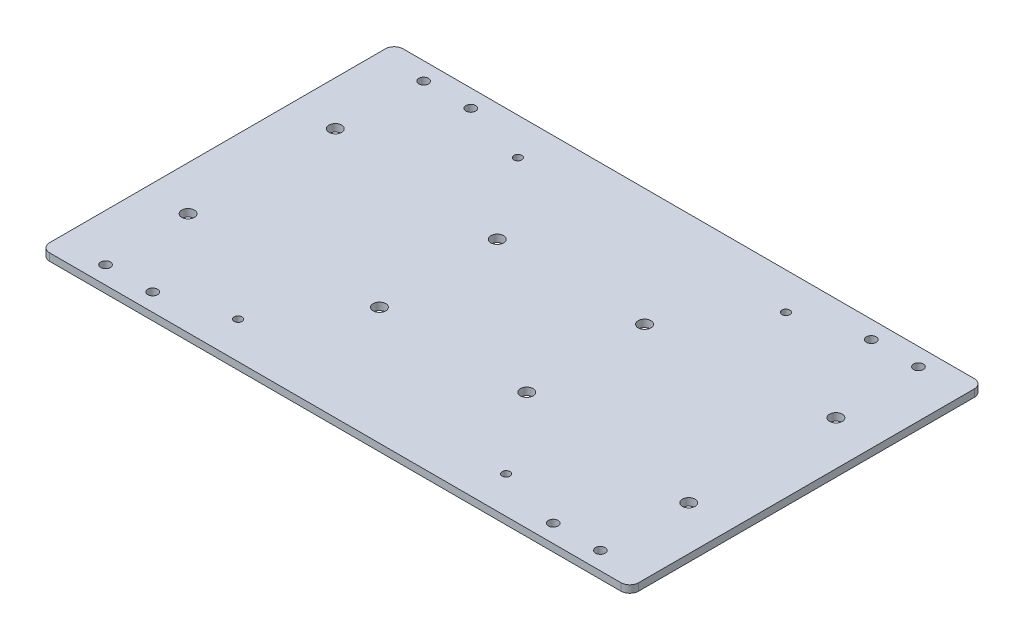
ISO-10303-21;
HEADER;
FILE_DESCRIPTION(('STEP AP214'),'2;1');
FILE_NAME('part.step','',(''),(''),'','','');
FILE_SCHEMA(('AUTOMOTIVE_DESIGN { 1 0 10303 214 1 1 1 1 }'));
ENDSEC;
DATA;
#1=APPLICATION_CONTEXT('core data for automotive mechanical design processes');
#2=APPLICATION_PROTOCOL_DEFINITION('international standard','automotive_design',2000,#1);
#3=PRODUCT_CONTEXT('',#1,'mechanical');
#4=PRODUCT('Part','Part','',(#3));
#5=PRODUCT_RELATED_PRODUCT_CATEGORY('part','',(#4));
#6=PRODUCT_DEFINITION_FORMATION('','',#4);
#7=PRODUCT_DEFINITION_CONTEXT('part definition',#1,'design');
#8=PRODUCT_DEFINITION('design','',#6,#7);
#9=PRODUCT_DEFINITION_SHAPE('','',#8);
#10=(LENGTH_UNIT() NAMED_UNIT(*) SI_UNIT(.MILLI.,.METRE.));
#11=(NAMED_UNIT(*) PLANE_ANGLE_UNIT() SI_UNIT($,.RADIAN.));
#12=(NAMED_UNIT(*) SI_UNIT($,.STERADIAN.) SOLID_ANGLE_UNIT());
#13=UNCERTAINTY_MEASURE_WITH_UNIT(LENGTH_MEASURE(1.E-05),#10,'distance_accuracy_value','');
#14=(GEOMETRIC_REPRESENTATION_CONTEXT(3) GLOBAL_UNCERTAINTY_ASSIGNED_CONTEXT((#13)) GLOBAL_UNIT_ASSIGNED_CONTEXT((#10,
#11,#12)) REPRESENTATION_CONTEXT('',''));
#15=CARTESIAN_POINT('',(0.,0.,0.));
#16=DIRECTION('',(0.,0.,1.));
#17=DIRECTION('',(1.,0.,0.));
#18=AXIS2_PLACEMENT_3D('',#15,#16,#17);
#19=CARTESIAN_POINT('',(0.,2.5,0.));
#20=DIRECTION('',(0.,1.,0.));
#21=DIRECTION('',(0.,0.,1.));
#22=AXIS2_PLACEMENT_3D('',#19,#20,#21);
#23=PLANE('',#22);
#24=CARTESIAN_POINT('',(45.5,2.5,-47.5));
#25=DIRECTION('',(0.,1.,0.));
#26=DIRECTION('',(0.,0.,1.));
#27=AXIS2_PLACEMENT_3D('',#24,#25,#26);
#28=CIRCLE('',#27,1.35000000000001);
#29=CARTESIAN_POINT('',(45.5,2.5,-46.15));
#30=VERTEX_POINT('',#29);
#31=EDGE_CURVE('E334',#30,#30,#28,.T.);
#32=ORIENTED_EDGE('',*,*,#31,.F.);
#33=EDGE_LOOP('',(#32));
#34=FACE_BOUND('',#33,.T.);
#35=CARTESIAN_POINT('',(-45.5,2.5,47.5));
#36=DIRECTION('',(0.,1.,0.));
#37=DIRECTION('',(0.,0.,1.));
#38=AXIS2_PLACEMENT_3D('',#35,#36,#37);
#39=CIRCLE('',#38,1.35000000000001);
#40=CARTESIAN_POINT('',(-45.5,2.5,48.85));
#41=VERTEX_POINT('',#40);
#42=EDGE_CURVE('E335',#41,#41,#39,.T.);
#43=ORIENTED_EDGE('',*,*,#42,.F.);
#44=EDGE_LOOP('',(#43));
#45=FACE_BOUND('',#44,.T.);
#46=CARTESIAN_POINT('',(45.5,2.5,47.5));
#47=DIRECTION('',(0.,1.,0.));
#48=DIRECTION('',(0.,0.,1.));
#49=AXIS2_PLACEMENT_3D('',#46,#47,#48);
#50=CIRCLE('',#49,1.35000000000001);
#51=CARTESIAN_POINT('',(45.5,2.5,48.85));
#52=VERTEX_POINT('',#51);
#53=EDGE_CURVE('E349',#52,#52,#50,.T.);
#54=ORIENTED_EDGE('',*,*,#53,.F.);
#55=EDGE_LOOP('',(#54));
#56=FACE_BOUND('',#55,.T.);
#57=CARTESIAN_POINT('',(-45.5,2.5,-47.5));
#58=DIRECTION('',(0.,1.,0.));
#59=DIRECTION('',(0.,0.,1.));
#60=AXIS2_PLACEMENT_3D('',#57,#58,#59);
#61=CIRCLE('',#60,1.35000000000001);
#62=CARTESIAN_POINT('',(-45.5,2.5,-46.15));
#63=VERTEX_POINT('',#62);
#64=EDGE_CURVE('E325',#63,#63,#61,.T.);
#65=ORIENTED_EDGE('',*,*,#64,.F.);
#66=EDGE_LOOP('',(#65));
#67=FACE_BOUND('',#66,.T.);
#68=CARTESIAN_POINT('',(-85.,2.5,25.));
#69=DIRECTION('',(0.,1.,0.));
#70=DIRECTION('',(0.,0.,-1.));
#71=AXIS2_PLACEMENT_3D('',#68,#69,#70);
#72=CIRCLE('',#71,2.15);
#73=CARTESIAN_POINT('',(-85.,2.5,22.85));
#74=VERTEX_POINT('',#73);
#75=EDGE_CURVE('E302',#74,#74,#72,.T.);
#76=ORIENTED_EDGE('',*,*,#75,.F.);
#77=EDGE_LOOP('',(#76));
#78=FACE_BOUND('',#77,.T.);
#79=CARTESIAN_POINT('',(85.,2.5,-25.));
#80=DIRECTION('',(0.,1.,0.));
#81=DIRECTION('',(0.,0.,1.));
#82=AXIS2_PLACEMENT_3D('',#79,#80,#81);
#83=CIRCLE('',#82,2.15);
#84=CARTESIAN_POINT('',(85.,2.5,-22.85));
#85=VERTEX_POINT('',#84);
#86=EDGE_CURVE('E286',#85,#85,#83,.T.);
#87=ORIENTED_EDGE('',*,*,#86,.F.);
#88=EDGE_LOOP('',(#87));
#89=FACE_BOUND('',#88,.T.);
#90=CARTESIAN_POINT('',(25.,2.5,20.));
#91=DIRECTION('',(0.,1.,0.));
#92=DIRECTION('',(0.,0.,1.));
#93=AXIS2_PLACEMENT_3D('',#90,#91,#92);
#94=CIRCLE('',#93,2.15);
#95=CARTESIAN_POINT('',(25.,2.5,22.15));
#96=VERTEX_POINT('',#95);
#97=EDGE_CURVE('E270',#96,#96,#94,.T.);
#98=ORIENTED_EDGE('',*,*,#97,.F.);
#99=EDGE_LOOP('',(#98));
#100=FACE_BOUND('',#99,.T.);
#101=CARTESIAN_POINT('',(25.,2.5,-20.));
#102=DIRECTION('',(0.,1.,0.));
#103=DIRECTION('',(0.,0.,1.));
#104=AXIS2_PLACEMENT_3D('',#101,#102,#103);
#105=CIRCLE('',#104,2.15);
#106=CARTESIAN_POINT('',(25.,2.5,-17.85));
#107=VERTEX_POINT('',#106);
#108=EDGE_CURVE('E254',#107,#107,#105,.T.);
#109=ORIENTED_EDGE('',*,*,#108,.F.);
#110=EDGE_LOOP('',(#109));
#111=FACE_BOUND('',#110,.T.);
#112=CARTESIAN_POINT('',(-68.,2.5,54.));
#113=DIRECTION('',(0.,1.,0.));
#114=DIRECTION('',(0.,0.,-1.));
#115=AXIS2_PLACEMENT_3D('',#112,#113,#114);
#116=CIRCLE('',#115,1.65);
#117=CARTESIAN_POINT('',(-68.,2.5,52.35));
#118=VERTEX_POINT('',#117);
#119=EDGE_CURVE('E238',#118,#118,#116,.T.);
#120=ORIENTED_EDGE('',*,*,#119,.F.);
#121=EDGE_LOOP('',(#120));
#122=FACE_BOUND('',#121,.T.);
#123=CARTESIAN_POINT('',(84.,2.5,54.));
#124=DIRECTION('',(0.,1.,0.));
#125=DIRECTION('',(0.,0.,-1.));
#126=AXIS2_PLACEMENT_3D('',#123,#124,#125);
#127=CIRCLE('',#126,1.65);
#128=CARTESIAN_POINT('',(84.,2.5,52.35));
#129=VERTEX_POINT('',#128);
#130=EDGE_CURVE('E222',#129,#129,#127,.T.);
#131=ORIENTED_EDGE('',*,*,#130,.F.);
#132=EDGE_LOOP('',(#131));
#133=FACE_BOUND('',#132,.T.);
#134=CARTESIAN_POINT('',(68.,2.5,-54.));
#135=DIRECTION('',(0.,1.,0.));
#136=DIRECTION('',(0.,0.,1.));
#137=AXIS2_PLACEMENT_3D('',#134,#135,#136);
#138=CIRCLE('',#137,1.65);
#139=CARTESIAN_POINT('',(68.,2.5,-52.35));
#140=VERTEX_POINT('',#139);
#141=EDGE_CURVE('E206',#140,#140,#138,.T.);
#142=ORIENTED_EDGE('',*,*,#141,.F.);
#143=EDGE_LOOP('',(#142));
#144=FACE_BOUND('',#143,.T.);
#145=CARTESIAN_POINT('',(-84.,2.5,-54.));
#146=DIRECTION('',(0.,1.,0.));
#147=DIRECTION('',(0.,0.,1.));
#148=AXIS2_PLACEMENT_3D('',#145,#146,#147);
#149=CIRCLE('',#148,1.65);
#150=CARTESIAN_POINT('',(-84.,2.5,-52.35));
#151=VERTEX_POINT('',#150);
#152=EDGE_CURVE('E143',#151,#151,#149,.T.);
#153=ORIENTED_EDGE('',*,*,#152,.F.);
#154=EDGE_LOOP('',(#153));
#155=FACE_BOUND('',#154,.T.);
#156=DIRECTION('',(0.,0.,1.));
#157=VECTOR('',#156,1.);
#158=CARTESIAN_POINT('',(-100.,2.5,-60.));
#159=LINE('',#158,#157);
#160=CARTESIAN_POINT('',(-100.,2.5,-57.));
#161=VERTEX_POINT('',#160);
#162=CARTESIAN_POINT('',(-100.,2.5,57.));
#163=VERTEX_POINT('',#162);
#164=EDGE_CURVE('E149',#161,#163,#159,.T.);
#165=ORIENTED_EDGE('',*,*,#164,.T.);
#166=CARTESIAN_POINT('',(-97.,2.5,57.));
#167=DIRECTION('',(0.,1.,0.));
#168=DIRECTION('',(0.,0.,1.));
#169=AXIS2_PLACEMENT_3D('',#166,#167,#168);
#170=CIRCLE('',#169,3.);
#171=CARTESIAN_POINT('',(-97.,2.5,60.));
#172=VERTEX_POINT('',#171);
#173=EDGE_CURVE('E173',#163,#172,#170,.T.);
#174=ORIENTED_EDGE('',*,*,#173,.T.);
#175=DIRECTION('',(1.,0.,0.));
#176=VECTOR('',#175,1.);
#177=CARTESIAN_POINT('',(-100.,2.5,60.));
#178=LINE('',#177,#176);
#179=CARTESIAN_POINT('',(97.,2.5,60.));
#180=VERTEX_POINT('',#179);
#181=EDGE_CURVE('E126',#172,#180,#178,.T.);
#182=ORIENTED_EDGE('',*,*,#181,.T.);
#183=CARTESIAN_POINT('',(97.,2.5,57.));
#184=DIRECTION('',(0.,1.,0.));
#185=DIRECTION('',(0.,0.,1.));
#186=AXIS2_PLACEMENT_3D('',#183,#184,#185);
#187=CIRCLE('',#186,3.);
#188=CARTESIAN_POINT('',(100.,2.5,57.));
#189=VERTEX_POINT('',#188);
#190=EDGE_CURVE('E170',#180,#189,#187,.T.);
#191=ORIENTED_EDGE('',*,*,#190,.T.);
#192=DIRECTION('',(0.,0.,-1.));
#193=VECTOR('',#192,1.);
#194=CARTESIAN_POINT('',(100.,2.5,-60.));
#195=LINE('',#194,#193);
#196=CARTESIAN_POINT('',(100.,2.5,-57.));
#197=VERTEX_POINT('',#196);
#198=EDGE_CURVE('E185',#189,#197,#195,.T.);
#199=ORIENTED_EDGE('',*,*,#198,.T.);
#200=CARTESIAN_POINT('',(97.,2.5,-57.));
#201=DIRECTION('',(0.,1.,0.));
#202=DIRECTION('',(0.,0.,1.));
#203=AXIS2_PLACEMENT_3D('',#200,#201,#202);
#204=CIRCLE('',#203,3.);
#205=CARTESIAN_POINT('',(97.,2.5,-60.));
#206=VERTEX_POINT('',#205);
#207=EDGE_CURVE('E60',#197,#206,#204,.T.);
#208=ORIENTED_EDGE('',*,*,#207,.T.);
#209=DIRECTION('',(-1.,0.,0.));
#210=VECTOR('',#209,1.);
#211=CARTESIAN_POINT('',(-100.,2.5,-60.));
#212=LINE('',#211,#210);
#213=CARTESIAN_POINT('',(-97.,2.5,-60.));
#214=VERTEX_POINT('',#213);
#215=EDGE_CURVE('E151',#206,#214,#212,.T.);
#216=ORIENTED_EDGE('',*,*,#215,.T.);
#217=CARTESIAN_POINT('',(-97.,2.5,-57.));
#218=DIRECTION('',(0.,1.,0.));
#219=DIRECTION('',(0.,0.,1.));
#220=AXIS2_PLACEMENT_3D('',#217,#218,#219);
#221=CIRCLE('',#220,3.);
#222=EDGE_CURVE('E165',#214,#161,#221,.T.);
#223=ORIENTED_EDGE('',*,*,#222,.T.);
#224=EDGE_LOOP('',(#165,#174,#182,#191,#199,#208,#216,#223));
#225=FACE_BOUND('',#224,.T.);
#226=CARTESIAN_POINT('',(-68.,2.5,-54.));
#227=DIRECTION('',(0.,1.,0.));
#228=DIRECTION('',(0.,0.,1.));
#229=AXIS2_PLACEMENT_3D('',#226,#227,#228);
#230=CIRCLE('',#229,1.65);
#231=CARTESIAN_POINT('',(-68.,2.5,-52.35));
#232=VERTEX_POINT('',#231);
#233=EDGE_CURVE('E198',#232,#232,#230,.T.);
#234=ORIENTED_EDGE('',*,*,#233,.F.);
#235=EDGE_LOOP('',(#234));
#236=FACE_BOUND('',#235,.T.);
#237=CARTESIAN_POINT('',(84.,2.5,-54.));
#238=DIRECTION('',(0.,1.,0.));
#239=DIRECTION('',(0.,0.,1.));
#240=AXIS2_PLACEMENT_3D('',#237,#238,#239);
#241=CIRCLE('',#240,1.65);
#242=CARTESIAN_POINT('',(84.,2.5,-52.35));
#243=VERTEX_POINT('',#242);
#244=EDGE_CURVE('E214',#243,#243,#241,.T.);
#245=ORIENTED_EDGE('',*,*,#244,.F.);
#246=EDGE_LOOP('',(#245));
#247=FACE_BOUND('',#246,.T.);
#248=CARTESIAN_POINT('',(68.,2.5,54.));
#249=DIRECTION('',(0.,1.,0.));
#250=DIRECTION('',(0.,0.,-1.));
#251=AXIS2_PLACEMENT_3D('',#248,#249,#250);
#252=CIRCLE('',#251,1.65);
#253=CARTESIAN_POINT('',(68.,2.5,52.35));
#254=VERTEX_POINT('',#253);
#255=EDGE_CURVE('E230',#254,#254,#252,.T.);
#256=ORIENTED_EDGE('',*,*,#255,.F.);
#257=EDGE_LOOP('',(#256));
#258=FACE_BOUND('',#257,.T.);
#259=CARTESIAN_POINT('',(-84.,2.5,54.));
#260=DIRECTION('',(0.,1.,0.));
#261=DIRECTION('',(0.,0.,-1.));
#262=AXIS2_PLACEMENT_3D('',#259,#260,#261);
#263=CIRCLE('',#262,1.65);
#264=CARTESIAN_POINT('',(-84.,2.5,52.35));
#265=VERTEX_POINT('',#264);
#266=EDGE_CURVE('E246',#265,#265,#263,.T.);
#267=ORIENTED_EDGE('',*,*,#266,.F.);
#268=EDGE_LOOP('',(#267));
#269=FACE_BOUND('',#268,.T.);
#270=CARTESIAN_POINT('',(-25.,2.5,-20.));
#271=DIRECTION('',(0.,1.,0.));
#272=DIRECTION('',(0.,0.,1.));
#273=AXIS2_PLACEMENT_3D('',#270,#271,#272);
#274=CIRCLE('',#273,2.15);
#275=CARTESIAN_POINT('',(-25.,2.5,-17.85));
#276=VERTEX_POINT('',#275);
#277=EDGE_CURVE('E262',#276,#276,#274,.T.);
#278=ORIENTED_EDGE('',*,*,#277,.F.);
#279=EDGE_LOOP('',(#278));
#280=FACE_BOUND('',#279,.T.);
#281=CARTESIAN_POINT('',(-25.,2.5,20.));
#282=DIRECTION('',(0.,1.,0.));
#283=DIRECTION('',(0.,0.,1.));
#284=AXIS2_PLACEMENT_3D('',#281,#282,#283);
#285=CIRCLE('',#284,2.15);
#286=CARTESIAN_POINT('',(-25.,2.5,22.15));
#287=VERTEX_POINT('',#286);
#288=EDGE_CURVE('E278',#287,#287,#285,.T.);
#289=ORIENTED_EDGE('',*,*,#288,.F.);
#290=EDGE_LOOP('',(#289));
#291=FACE_BOUND('',#290,.T.);
#292=CARTESIAN_POINT('',(85.,2.5,25.));
#293=DIRECTION('',(0.,1.,0.));
#294=DIRECTION('',(0.,0.,1.));
#295=AXIS2_PLACEMENT_3D('',#292,#293,#294);
#296=CIRCLE('',#295,2.15);
#297=CARTESIAN_POINT('',(85.,2.5,27.15));
#298=VERTEX_POINT('',#297);
#299=EDGE_CURVE('E294',#298,#298,#296,.T.);
#300=ORIENTED_EDGE('',*,*,#299,.F.);
#301=EDGE_LOOP('',(#300));
#302=FACE_BOUND('',#301,.T.);
#303=CARTESIAN_POINT('',(-85.,2.5,-25.));
#304=DIRECTION('',(0.,1.,0.));
#305=DIRECTION('',(0.,0.,-1.));
#306=AXIS2_PLACEMENT_3D('',#303,#304,#305);
#307=CIRCLE('',#306,2.15);
#308=CARTESIAN_POINT('',(-85.,2.5,-27.15));
#309=VERTEX_POINT('',#308);
#310=EDGE_CURVE('E310',#309,#309,#307,.T.);
#311=ORIENTED_EDGE('',*,*,#310,.F.);
#312=EDGE_LOOP('',(#311));
#313=FACE_BOUND('',#312,.T.);
#314=ADVANCED_FACE('F38',(#34,#45,#56,#67,#78,#89,#100,#111,#122,#133,#144,#155,#225,#236,#247,
#258,#269,#280,#291,#302,#313),#23,.T.);
#315=CARTESIAN_POINT('',(0.,0.,0.));
#316=DIRECTION('',(0.,1.,0.));
#317=DIRECTION('',(0.,0.,1.));
#318=AXIS2_PLACEMENT_3D('',#315,#316,#317);
#319=PLANE('',#318);
#320=CARTESIAN_POINT('',(45.5,0.,-47.5));
#321=DIRECTION('',(0.,1.,0.));
#322=DIRECTION('',(0.,0.,1.));
#323=AXIS2_PLACEMENT_3D('',#320,#321,#322);
#324=CIRCLE('',#323,1.35000000000001);
#325=CARTESIAN_POINT('',(45.5,0.,-46.15));
#326=VERTEX_POINT('',#325);
#327=EDGE_CURVE('E329',#326,#326,#324,.F.);
#328=ORIENTED_EDGE('',*,*,#327,.F.);
#329=EDGE_LOOP('',(#328));
#330=FACE_BOUND('',#329,.T.);
#331=CARTESIAN_POINT('',(-45.5,0.,47.5));
#332=DIRECTION('',(0.,1.,0.));
#333=DIRECTION('',(0.,0.,1.));
#334=AXIS2_PLACEMENT_3D('',#331,#332,#333);
#335=CIRCLE('',#334,1.35000000000001);
#336=CARTESIAN_POINT('',(-45.5,0.,48.85));
#337=VERTEX_POINT('',#336);
#338=EDGE_CURVE('E330',#337,#337,#335,.F.);
#339=ORIENTED_EDGE('',*,*,#338,.F.);
#340=EDGE_LOOP('',(#339));
#341=FACE_BOUND('',#340,.T.);
#342=CARTESIAN_POINT('',(45.5,0.,47.5));
#343=DIRECTION('',(0.,1.,0.));
#344=DIRECTION('',(0.,0.,1.));
#345=AXIS2_PLACEMENT_3D('',#342,#343,#344);
#346=CIRCLE('',#345,1.35000000000001);
#347=CARTESIAN_POINT('',(45.5,0.,48.85));
#348=VERTEX_POINT('',#347);
#349=EDGE_CURVE('E339',#348,#348,#346,.F.);
#350=ORIENTED_EDGE('',*,*,#349,.F.);
#351=EDGE_LOOP('',(#350));
#352=FACE_BOUND('',#351,.T.);
#353=CARTESIAN_POINT('',(-45.5,0.,-47.5));
#354=DIRECTION('',(0.,1.,0.));
#355=DIRECTION('',(0.,0.,1.));
#356=AXIS2_PLACEMENT_3D('',#353,#354,#355);
#357=CIRCLE('',#356,1.35000000000001);
#358=CARTESIAN_POINT('',(-45.5,0.,-46.15));
#359=VERTEX_POINT('',#358);
#360=EDGE_CURVE('E318',#359,#359,#357,.F.);
#361=ORIENTED_EDGE('',*,*,#360,.F.);
#362=EDGE_LOOP('',(#361));
#363=FACE_BOUND('',#362,.T.);
#364=DIRECTION('',(1.,0.,0.));
#365=VECTOR('',#364,1.);
#366=CARTESIAN_POINT('',(-100.,0.,60.));
#367=LINE('',#366,#365);
#368=CARTESIAN_POINT('',(-97.,0.,60.));
#369=VERTEX_POINT('',#368);
#370=CARTESIAN_POINT('',(97.,0.,60.));
#371=VERTEX_POINT('',#370);
#372=EDGE_CURVE('E123',#369,#371,#367,.T.);
#373=ORIENTED_EDGE('',*,*,#372,.F.);
#374=CARTESIAN_POINT('',(-97.,0.,57.));
#375=DIRECTION('',(0.,1.,0.));
#376=DIRECTION('',(0.,0.,1.));
#377=AXIS2_PLACEMENT_3D('',#374,#375,#376);
#378=CIRCLE('',#377,3.);
#379=CARTESIAN_POINT('',(-100.,0.,57.));
#380=VERTEX_POINT('',#379);
#381=EDGE_CURVE('E105',#369,#380,#378,.F.);
#382=ORIENTED_EDGE('',*,*,#381,.T.);
#383=DIRECTION('',(0.,0.,1.));
#384=VECTOR('',#383,1.);
#385=CARTESIAN_POINT('',(-100.,0.,-60.));
#386=LINE('',#385,#384);
#387=CARTESIAN_POINT('',(-100.,0.,-57.));
#388=VERTEX_POINT('',#387);
#389=EDGE_CURVE('E136',#388,#380,#386,.T.);
#390=ORIENTED_EDGE('',*,*,#389,.F.);
#391=CARTESIAN_POINT('',(-97.,0.,-57.));
#392=DIRECTION('',(0.,1.,0.));
#393=DIRECTION('',(0.,0.,1.));
#394=AXIS2_PLACEMENT_3D('',#391,#392,#393);
#395=CIRCLE('',#394,3.);
#396=CARTESIAN_POINT('',(-97.,0.,-60.));
#397=VERTEX_POINT('',#396);
#398=EDGE_CURVE('E128',#388,#397,#395,.F.);
#399=ORIENTED_EDGE('',*,*,#398,.T.);
#400=DIRECTION('',(-1.,0.,0.));
#401=VECTOR('',#400,1.);
#402=CARTESIAN_POINT('',(-100.,0.,-60.));
#403=LINE('',#402,#401);
#404=CARTESIAN_POINT('',(97.,0.,-60.));
#405=VERTEX_POINT('',#404);
#406=EDGE_CURVE('E141',#405,#397,#403,.T.);
#407=ORIENTED_EDGE('',*,*,#406,.F.);
#408=CARTESIAN_POINT('',(97.,0.,-57.));
#409=DIRECTION('',(0.,1.,0.));
#410=DIRECTION('',(0.,0.,1.));
#411=AXIS2_PLACEMENT_3D('',#408,#409,#410);
#412=CIRCLE('',#411,3.);
#413=CARTESIAN_POINT('',(100.,0.,-57.));
#414=VERTEX_POINT('',#413);
#415=EDGE_CURVE('E155',#405,#414,#412,.F.);
#416=ORIENTED_EDGE('',*,*,#415,.T.);
#417=DIRECTION('',(0.,0.,-1.));
#418=VECTOR('',#417,1.);
#419=CARTESIAN_POINT('',(100.,0.,-60.));
#420=LINE('',#419,#418);
#421=CARTESIAN_POINT('',(100.,0.,57.));
#422=VERTEX_POINT('',#421);
#423=EDGE_CURVE('E135',#422,#414,#420,.T.);
#424=ORIENTED_EDGE('',*,*,#423,.F.);
#425=CARTESIAN_POINT('',(97.,0.,57.));
#426=DIRECTION('',(0.,1.,0.));
#427=DIRECTION('',(0.,0.,1.));
#428=AXIS2_PLACEMENT_3D('',#425,#426,#427);
#429=CIRCLE('',#428,3.);
#430=EDGE_CURVE('E117',#422,#371,#429,.F.);
#431=ORIENTED_EDGE('',*,*,#430,.T.);
#432=EDGE_LOOP('',(#373,#382,#390,#399,#407,#416,#424,#431));
#433=FACE_BOUND('',#432,.T.);
#434=CARTESIAN_POINT('',(-84.,0.,-54.));
#435=DIRECTION('',(0.,1.,0.));
#436=DIRECTION('',(0.,0.,1.));
#437=AXIS2_PLACEMENT_3D('',#434,#435,#436);
#438=CIRCLE('',#437,1.65);
#439=CARTESIAN_POINT('',(-84.,0.,-52.35));
#440=VERTEX_POINT('',#439);
#441=EDGE_CURVE('E194',#440,#440,#438,.T.);
#442=ORIENTED_EDGE('',*,*,#441,.T.);
#443=EDGE_LOOP('',(#442));
#444=FACE_BOUND('',#443,.T.);
#445=CARTESIAN_POINT('',(-68.,0.,-54.));
#446=DIRECTION('',(0.,1.,0.));
#447=DIRECTION('',(0.,0.,1.));
#448=AXIS2_PLACEMENT_3D('',#445,#446,#447);
#449=CIRCLE('',#448,1.65);
#450=CARTESIAN_POINT('',(-68.,0.,-52.35));
#451=VERTEX_POINT('',#450);
#452=EDGE_CURVE('E202',#451,#451,#449,.T.);
#453=ORIENTED_EDGE('',*,*,#452,.T.);
#454=EDGE_LOOP('',(#453));
#455=FACE_BOUND('',#454,.T.);
#456=CARTESIAN_POINT('',(68.,0.,-54.));
#457=DIRECTION('',(0.,1.,0.));
#458=DIRECTION('',(0.,0.,1.));
#459=AXIS2_PLACEMENT_3D('',#456,#457,#458);
#460=CIRCLE('',#459,1.65);
#461=CARTESIAN_POINT('',(68.,0.,-52.35));
#462=VERTEX_POINT('',#461);
#463=EDGE_CURVE('E210',#462,#462,#460,.T.);
#464=ORIENTED_EDGE('',*,*,#463,.T.);
#465=EDGE_LOOP('',(#464));
#466=FACE_BOUND('',#465,.T.);
#467=CARTESIAN_POINT('',(84.,0.,-54.));
#468=DIRECTION('',(0.,1.,0.));
#469=DIRECTION('',(0.,0.,1.));
#470=AXIS2_PLACEMENT_3D('',#467,#468,#469);
#471=CIRCLE('',#470,1.65);
#472=CARTESIAN_POINT('',(84.,0.,-52.35));
#473=VERTEX_POINT('',#472);
#474=EDGE_CURVE('E218',#473,#473,#471,.T.);
#475=ORIENTED_EDGE('',*,*,#474,.T.);
#476=EDGE_LOOP('',(#475));
#477=FACE_BOUND('',#476,.T.);
#478=CARTESIAN_POINT('',(84.,0.,54.));
#479=DIRECTION('',(0.,1.,0.));
#480=DIRECTION('',(0.,0.,-1.));
#481=AXIS2_PLACEMENT_3D('',#478,#479,#480);
#482=CIRCLE('',#481,1.65);
#483=CARTESIAN_POINT('',(84.,0.,52.35));
#484=VERTEX_POINT('',#483);
#485=EDGE_CURVE('E226',#484,#484,#482,.T.);
#486=ORIENTED_EDGE('',*,*,#485,.T.);
#487=EDGE_LOOP('',(#486));
#488=FACE_BOUND('',#487,.T.);
#489=CARTESIAN_POINT('',(68.,0.,54.));
#490=DIRECTION('',(0.,1.,0.));
#491=DIRECTION('',(0.,0.,-1.));
#492=AXIS2_PLACEMENT_3D('',#489,#490,#491);
#493=CIRCLE('',#492,1.65);
#494=CARTESIAN_POINT('',(68.,0.,52.35));
#495=VERTEX_POINT('',#494);
#496=EDGE_CURVE('E234',#495,#495,#493,.T.);
#497=ORIENTED_EDGE('',*,*,#496,.T.);
#498=EDGE_LOOP('',(#497));
#499=FACE_BOUND('',#498,.T.);
#500=CARTESIAN_POINT('',(-68.,0.,54.));
#501=DIRECTION('',(0.,1.,0.));
#502=DIRECTION('',(0.,0.,-1.));
#503=AXIS2_PLACEMENT_3D('',#500,#501,#502);
#504=CIRCLE('',#503,1.65);
#505=CARTESIAN_POINT('',(-68.,0.,52.35));
#506=VERTEX_POINT('',#505);
#507=EDGE_CURVE('E242',#506,#506,#504,.T.);
#508=ORIENTED_EDGE('',*,*,#507,.T.);
#509=EDGE_LOOP('',(#508));
#510=FACE_BOUND('',#509,.T.);
#511=CARTESIAN_POINT('',(-84.,0.,54.));
#512=DIRECTION('',(0.,1.,0.));
#513=DIRECTION('',(0.,0.,-1.));
#514=AXIS2_PLACEMENT_3D('',#511,#512,#513);
#515=CIRCLE('',#514,1.65);
#516=CARTESIAN_POINT('',(-84.,0.,52.35));
#517=VERTEX_POINT('',#516);
#518=EDGE_CURVE('E250',#517,#517,#515,.T.);
#519=ORIENTED_EDGE('',*,*,#518,.T.);
#520=EDGE_LOOP('',(#519));
#521=FACE_BOUND('',#520,.T.);
#522=CARTESIAN_POINT('',(25.,0.,-20.));
#523=DIRECTION('',(0.,1.,0.));
#524=DIRECTION('',(0.,0.,1.));
#525=AXIS2_PLACEMENT_3D('',#522,#523,#524);
#526=CIRCLE('',#525,2.15);
#527=CARTESIAN_POINT('',(25.,0.,-17.85));
#528=VERTEX_POINT('',#527);
#529=EDGE_CURVE('E258',#528,#528,#526,.T.);
#530=ORIENTED_EDGE('',*,*,#529,.T.);
#531=EDGE_LOOP('',(#530));
#532=FACE_BOUND('',#531,.T.);
#533=CARTESIAN_POINT('',(-25.,0.,-20.));
#534=DIRECTION('',(0.,1.,0.));
#535=DIRECTION('',(0.,0.,1.));
#536=AXIS2_PLACEMENT_3D('',#533,#534,#535);
#537=CIRCLE('',#536,2.15);
#538=CARTESIAN_POINT('',(-25.,0.,-17.85));
#539=VERTEX_POINT('',#538);
#540=EDGE_CURVE('E266',#539,#539,#537,.T.);
#541=ORIENTED_EDGE('',*,*,#540,.T.);
#542=EDGE_LOOP('',(#541));
#543=FACE_BOUND('',#542,.T.);
#544=CARTESIAN_POINT('',(25.,0.,20.));
#545=DIRECTION('',(0.,1.,0.));
#546=DIRECTION('',(0.,0.,1.));
#547=AXIS2_PLACEMENT_3D('',#544,#545,#546);
#548=CIRCLE('',#547,2.15);
#549=CARTESIAN_POINT('',(25.,0.,22.15));
#550=VERTEX_POINT('',#549);
#551=EDGE_CURVE('E274',#550,#550,#548,.T.);
#552=ORIENTED_EDGE('',*,*,#551,.T.);
#553=EDGE_LOOP('',(#552));
#554=FACE_BOUND('',#553,.T.);
#555=CARTESIAN_POINT('',(-25.,0.,20.));
#556=DIRECTION('',(0.,1.,0.));
#557=DIRECTION('',(0.,0.,1.));
#558=AXIS2_PLACEMENT_3D('',#555,#556,#557);
#559=CIRCLE('',#558,2.15);
#560=CARTESIAN_POINT('',(-25.,0.,22.15));
#561=VERTEX_POINT('',#560);
#562=EDGE_CURVE('E282',#561,#561,#559,.T.);
#563=ORIENTED_EDGE('',*,*,#562,.T.);
#564=EDGE_LOOP('',(#563));
#565=FACE_BOUND('',#564,.T.);
#566=CARTESIAN_POINT('',(85.,0.,-25.));
#567=DIRECTION('',(0.,1.,0.));
#568=DIRECTION('',(0.,0.,1.));
#569=AXIS2_PLACEMENT_3D('',#566,#567,#568);
#570=CIRCLE('',#569,2.15);
#571=CARTESIAN_POINT('',(85.,0.,-22.85));
#572=VERTEX_POINT('',#571);
#573=EDGE_CURVE('E290',#572,#572,#570,.T.);
#574=ORIENTED_EDGE('',*,*,#573,.T.);
#575=EDGE_LOOP('',(#574));
#576=FACE_BOUND('',#575,.T.);
#577=CARTESIAN_POINT('',(85.,0.,25.));
#578=DIRECTION('',(0.,1.,0.));
#579=DIRECTION('',(0.,0.,1.));
#580=AXIS2_PLACEMENT_3D('',#577,#578,#579);
#581=CIRCLE('',#580,2.15);
#582=CARTESIAN_POINT('',(85.,0.,27.15));
#583=VERTEX_POINT('',#582);
#584=EDGE_CURVE('E298',#583,#583,#581,.T.);
#585=ORIENTED_EDGE('',*,*,#584,.T.);
#586=EDGE_LOOP('',(#585));
#587=FACE_BOUND('',#586,.T.);
#588=CARTESIAN_POINT('',(-85.,0.,25.));
#589=DIRECTION('',(0.,1.,0.));
#590=DIRECTION('',(0.,0.,-1.));
#591=AXIS2_PLACEMENT_3D('',#588,#589,#590);
#592=CIRCLE('',#591,2.15);
#593=CARTESIAN_POINT('',(-85.,0.,22.85));
#594=VERTEX_POINT('',#593);
#595=EDGE_CURVE('E306',#594,#594,#592,.T.);
#596=ORIENTED_EDGE('',*,*,#595,.T.);
#597=EDGE_LOOP('',(#596));
#598=FACE_BOUND('',#597,.T.);
#599=CARTESIAN_POINT('',(-85.,0.,-25.));
#600=DIRECTION('',(0.,1.,0.));
#601=DIRECTION('',(0.,0.,-1.));
#602=AXIS2_PLACEMENT_3D('',#599,#600,#601);
#603=CIRCLE('',#602,2.15);
#604=CARTESIAN_POINT('',(-85.,0.,-27.15));
#605=VERTEX_POINT('',#604);
#606=EDGE_CURVE('E314',#605,#605,#603,.T.);
#607=ORIENTED_EDGE('',*,*,#606,.T.);
#608=EDGE_LOOP('',(#607));
#609=FACE_BOUND('',#608,.T.);
#610=ADVANCED_FACE('F131',(#330,#341,#352,#363,#433,#444,#455,#466,#477,#488,#499,#510,#521,
#532,#543,#554,#565,#576,#587,#598,#609),#319,.F.);
#611=CARTESIAN_POINT('',(-100.,2.5,-60.));
#612=DIRECTION('',(1.,0.,0.));
#613=DIRECTION('',(0.,0.,-1.));
#614=AXIS2_PLACEMENT_3D('',#611,#612,#613);
#615=PLANE('',#614);
#616=ORIENTED_EDGE('',*,*,#389,.T.);
#617=DIRECTION('',(0.,-1.,0.));
#618=VECTOR('',#617,1.);
#619=CARTESIAN_POINT('',(-100.,2.5,57.));
#620=LINE('',#619,#618);
#621=EDGE_CURVE('E110',#380,#163,#620,.F.);
#622=ORIENTED_EDGE('',*,*,#621,.T.);
#623=ORIENTED_EDGE('',*,*,#164,.F.);
#624=DIRECTION('',(0.,-1.,0.));
#625=VECTOR('',#624,1.);
#626=CARTESIAN_POINT('',(-100.,2.5,-57.));
#627=LINE('',#626,#625);
#628=EDGE_CURVE('E116',#161,#388,#627,.T.);
#629=ORIENTED_EDGE('',*,*,#628,.T.);
#630=EDGE_LOOP('',(#616,#622,#623,#629));
#631=FACE_BOUND('',#630,.T.);
#632=ADVANCED_FACE('F404',(#631),#615,.F.);
#633=CARTESIAN_POINT('',(-100.,2.5,60.));
#634=DIRECTION('',(0.,0.,-1.));
#635=DIRECTION('',(-1.,0.,0.));
#636=AXIS2_PLACEMENT_3D('',#633,#634,#635);
#637=PLANE('',#636);
#638=ORIENTED_EDGE('',*,*,#181,.F.);
#639=DIRECTION('',(0.,-1.,0.));
#640=VECTOR('',#639,1.);
#641=CARTESIAN_POINT('',(-97.,2.5,60.));
#642=LINE('',#641,#640);
#643=EDGE_CURVE('E109',#172,#369,#642,.T.);
#644=ORIENTED_EDGE('',*,*,#643,.T.);
#645=ORIENTED_EDGE('',*,*,#372,.T.);
#646=DIRECTION('',(0.,-1.,0.));
#647=VECTOR('',#646,1.);
#648=CARTESIAN_POINT('',(97.,2.5,60.));
#649=LINE('',#648,#647);
#650=EDGE_CURVE('E129',#371,#180,#649,.F.);
#651=ORIENTED_EDGE('',*,*,#650,.T.);
#652=EDGE_LOOP('',(#638,#644,#645,#651));
#653=FACE_BOUND('',#652,.T.);
#654=ADVANCED_FACE('F122',(#653),#637,.F.);
#655=CARTESIAN_POINT('',(100.,2.5,-60.));
#656=DIRECTION('',(-1.,0.,0.));
#657=DIRECTION('',(0.,0.,1.));
#658=AXIS2_PLACEMENT_3D('',#655,#656,#657);
#659=PLANE('',#658);
#660=ORIENTED_EDGE('',*,*,#198,.F.);
#661=DIRECTION('',(0.,-1.,0.));
#662=VECTOR('',#661,1.);
#663=CARTESIAN_POINT('',(100.,2.5,57.));
#664=LINE('',#663,#662);
#665=EDGE_CURVE('E179',#189,#422,#664,.T.);
#666=ORIENTED_EDGE('',*,*,#665,.T.);
#667=ORIENTED_EDGE('',*,*,#423,.T.);
#668=DIRECTION('',(0.,-1.,0.));
#669=VECTOR('',#668,1.);
#670=CARTESIAN_POINT('',(100.,2.5,-57.));
#671=LINE('',#670,#669);
#672=EDGE_CURVE('E176',#414,#197,#671,.F.);
#673=ORIENTED_EDGE('',*,*,#672,.T.);
#674=EDGE_LOOP('',(#660,#666,#667,#673));
#675=FACE_BOUND('',#674,.T.);
#676=ADVANCED_FACE('F420',(#675),#659,.F.);
#677=CARTESIAN_POINT('',(-100.,2.5,-60.));
#678=DIRECTION('',(0.,0.,1.));
#679=DIRECTION('',(1.,0.,0.));
#680=AXIS2_PLACEMENT_3D('',#677,#678,#679);
#681=PLANE('',#680);
#682=ORIENTED_EDGE('',*,*,#215,.F.);
#683=DIRECTION('',(0.,-1.,0.));
#684=VECTOR('',#683,1.);
#685=CARTESIAN_POINT('',(97.,2.5,-60.));
#686=LINE('',#685,#684);
#687=EDGE_CURVE('E11',#206,#405,#686,.T.);
#688=ORIENTED_EDGE('',*,*,#687,.T.);
#689=ORIENTED_EDGE('',*,*,#406,.T.);
#690=DIRECTION('',(0.,-1.,0.));
#691=VECTOR('',#690,1.);
#692=CARTESIAN_POINT('',(-97.,2.5,-60.));
#693=LINE('',#692,#691);
#694=EDGE_CURVE('E47',#397,#214,#693,.F.);
#695=ORIENTED_EDGE('',*,*,#694,.T.);
#696=EDGE_LOOP('',(#682,#688,#689,#695));
#697=FACE_BOUND('',#696,.T.);
#698=ADVANCED_FACE('F416',(#697),#681,.F.);
#699=CARTESIAN_POINT('',(-84.,2.5,-54.));
#700=DIRECTION('',(0.,-1.,0.));
#701=DIRECTION('',(0.,0.,-1.));
#702=AXIS2_PLACEMENT_3D('',#699,#700,#701);
#703=CYLINDRICAL_SURFACE('',#702,1.65);
#704=ORIENTED_EDGE('',*,*,#152,.T.);
#705=EDGE_LOOP('',(#704));
#706=FACE_BOUND('',#705,.T.);
#707=ORIENTED_EDGE('',*,*,#441,.F.);
#708=EDGE_LOOP('',(#707));
#709=FACE_BOUND('',#708,.T.);
#710=ADVANCED_FACE('F419',(#706,#709),#703,.F.);
#711=CARTESIAN_POINT('',(-68.,2.5,-54.));
#712=DIRECTION('',(0.,-1.,0.));
#713=DIRECTION('',(0.,0.,-1.));
#714=AXIS2_PLACEMENT_3D('',#711,#712,#713);
#715=CYLINDRICAL_SURFACE('',#714,1.65);
#716=ORIENTED_EDGE('',*,*,#233,.T.);
#717=EDGE_LOOP('',(#716));
#718=FACE_BOUND('',#717,.T.);
#719=ORIENTED_EDGE('',*,*,#452,.F.);
#720=EDGE_LOOP('',(#719));
#721=FACE_BOUND('',#720,.T.);
#722=ADVANCED_FACE('F665',(#718,#721),#715,.F.);
#723=CARTESIAN_POINT('',(68.,2.5,-54.));
#724=DIRECTION('',(0.,-1.,0.));
#725=DIRECTION('',(0.,0.,-1.));
#726=AXIS2_PLACEMENT_3D('',#723,#724,#725);
#727=CYLINDRICAL_SURFACE('',#726,1.65);
#728=ORIENTED_EDGE('',*,*,#141,.T.);
#729=EDGE_LOOP('',(#728));
#730=FACE_BOUND('',#729,.T.);
#731=ORIENTED_EDGE('',*,*,#463,.F.);
#732=EDGE_LOOP('',(#731));
#733=FACE_BOUND('',#732,.T.);
#734=ADVANCED_FACE('F655',(#730,#733),#727,.F.);
#735=CARTESIAN_POINT('',(84.,2.5,-54.));
#736=DIRECTION('',(0.,-1.,0.));
#737=DIRECTION('',(0.,0.,-1.));
#738=AXIS2_PLACEMENT_3D('',#735,#736,#737);
#739=CYLINDRICAL_SURFACE('',#738,1.65);
#740=ORIENTED_EDGE('',*,*,#244,.T.);
#741=EDGE_LOOP('',(#740));
#742=FACE_BOUND('',#741,.T.);
#743=ORIENTED_EDGE('',*,*,#474,.F.);
#744=EDGE_LOOP('',(#743));
#745=FACE_BOUND('',#744,.T.);
#746=ADVANCED_FACE('F645',(#742,#745),#739,.F.);
#747=CARTESIAN_POINT('',(84.,2.5,54.));
#748=DIRECTION('',(0.,-1.,0.));
#749=DIRECTION('',(0.,0.,-1.));
#750=AXIS2_PLACEMENT_3D('',#747,#748,#749);
#751=CYLINDRICAL_SURFACE('',#750,1.65);
#752=ORIENTED_EDGE('',*,*,#130,.T.);
#753=EDGE_LOOP('',(#752));
#754=FACE_BOUND('',#753,.T.);
#755=ORIENTED_EDGE('',*,*,#485,.F.);
#756=EDGE_LOOP('',(#755));
#757=FACE_BOUND('',#756,.T.);
#758=ADVANCED_FACE('F635',(#754,#757),#751,.F.);
#759=CARTESIAN_POINT('',(68.,2.5,54.));
#760=DIRECTION('',(0.,-1.,0.));
#761=DIRECTION('',(0.,0.,-1.));
#762=AXIS2_PLACEMENT_3D('',#759,#760,#761);
#763=CYLINDRICAL_SURFACE('',#762,1.65);
#764=ORIENTED_EDGE('',*,*,#255,.T.);
#765=EDGE_LOOP('',(#764));
#766=FACE_BOUND('',#765,.T.);
#767=ORIENTED_EDGE('',*,*,#496,.F.);
#768=EDGE_LOOP('',(#767));
#769=FACE_BOUND('',#768,.T.);
#770=ADVANCED_FACE('F625',(#766,#769),#763,.F.);
#771=CARTESIAN_POINT('',(-68.,2.5,54.));
#772=DIRECTION('',(0.,-1.,0.));
#773=DIRECTION('',(0.,0.,-1.));
#774=AXIS2_PLACEMENT_3D('',#771,#772,#773);
#775=CYLINDRICAL_SURFACE('',#774,1.65);
#776=ORIENTED_EDGE('',*,*,#119,.T.);
#777=EDGE_LOOP('',(#776));
#778=FACE_BOUND('',#777,.T.);
#779=ORIENTED_EDGE('',*,*,#507,.F.);
#780=EDGE_LOOP('',(#779));
#781=FACE_BOUND('',#780,.T.);
#782=ADVANCED_FACE('F615',(#778,#781),#775,.F.);
#783=CARTESIAN_POINT('',(-84.,2.5,54.));
#784=DIRECTION('',(0.,-1.,0.));
#785=DIRECTION('',(0.,0.,-1.));
#786=AXIS2_PLACEMENT_3D('',#783,#784,#785);
#787=CYLINDRICAL_SURFACE('',#786,1.65);
#788=ORIENTED_EDGE('',*,*,#266,.T.);
#789=EDGE_LOOP('',(#788));
#790=FACE_BOUND('',#789,.T.);
#791=ORIENTED_EDGE('',*,*,#518,.F.);
#792=EDGE_LOOP('',(#791));
#793=FACE_BOUND('',#792,.T.);
#794=ADVANCED_FACE('F605',(#790,#793),#787,.F.);
#795=CARTESIAN_POINT('',(25.,2.5,-20.));
#796=DIRECTION('',(0.,-1.,0.));
#797=DIRECTION('',(0.,0.,-1.));
#798=AXIS2_PLACEMENT_3D('',#795,#796,#797);
#799=CYLINDRICAL_SURFACE('',#798,2.15);
#800=ORIENTED_EDGE('',*,*,#108,.T.);
#801=EDGE_LOOP('',(#800));
#802=FACE_BOUND('',#801,.T.);
#803=ORIENTED_EDGE('',*,*,#529,.F.);
#804=EDGE_LOOP('',(#803));
#805=FACE_BOUND('',#804,.T.);
#806=ADVANCED_FACE('F595',(#802,#805),#799,.F.);
#807=CARTESIAN_POINT('',(-25.,2.5,-20.));
#808=DIRECTION('',(0.,-1.,0.));
#809=DIRECTION('',(0.,0.,-1.));
#810=AXIS2_PLACEMENT_3D('',#807,#808,#809);
#811=CYLINDRICAL_SURFACE('',#810,2.15);
#812=ORIENTED_EDGE('',*,*,#277,.T.);
#813=EDGE_LOOP('',(#812));
#814=FACE_BOUND('',#813,.T.);
#815=ORIENTED_EDGE('',*,*,#540,.F.);
#816=EDGE_LOOP('',(#815));
#817=FACE_BOUND('',#816,.T.);
#818=ADVANCED_FACE('F585',(#814,#817),#811,.F.);
#819=CARTESIAN_POINT('',(25.,2.5,20.));
#820=DIRECTION('',(0.,-1.,0.));
#821=DIRECTION('',(0.,0.,-1.));
#822=AXIS2_PLACEMENT_3D('',#819,#820,#821);
#823=CYLINDRICAL_SURFACE('',#822,2.15);
#824=ORIENTED_EDGE('',*,*,#97,.T.);
#825=EDGE_LOOP('',(#824));
#826=FACE_BOUND('',#825,.T.);
#827=ORIENTED_EDGE('',*,*,#551,.F.);
#828=EDGE_LOOP('',(#827));
#829=FACE_BOUND('',#828,.T.);
#830=ADVANCED_FACE('F575',(#826,#829),#823,.F.);
#831=CARTESIAN_POINT('',(-25.,2.5,20.));
#832=DIRECTION('',(0.,-1.,0.));
#833=DIRECTION('',(0.,0.,-1.));
#834=AXIS2_PLACEMENT_3D('',#831,#832,#833);
#835=CYLINDRICAL_SURFACE('',#834,2.15);
#836=ORIENTED_EDGE('',*,*,#288,.T.);
#837=EDGE_LOOP('',(#836));
#838=FACE_BOUND('',#837,.T.);
#839=ORIENTED_EDGE('',*,*,#562,.F.);
#840=EDGE_LOOP('',(#839));
#841=FACE_BOUND('',#840,.T.);
#842=ADVANCED_FACE('F565',(#838,#841),#835,.F.);
#843=CARTESIAN_POINT('',(85.,2.5,-25.));
#844=DIRECTION('',(0.,-1.,0.));
#845=DIRECTION('',(0.,0.,-1.));
#846=AXIS2_PLACEMENT_3D('',#843,#844,#845);
#847=CYLINDRICAL_SURFACE('',#846,2.15);
#848=ORIENTED_EDGE('',*,*,#86,.T.);
#849=EDGE_LOOP('',(#848));
#850=FACE_BOUND('',#849,.T.);
#851=ORIENTED_EDGE('',*,*,#573,.F.);
#852=EDGE_LOOP('',(#851));
#853=FACE_BOUND('',#852,.T.);
#854=ADVANCED_FACE('F555',(#850,#853),#847,.F.);
#855=CARTESIAN_POINT('',(85.,2.5,25.));
#856=DIRECTION('',(0.,-1.,0.));
#857=DIRECTION('',(0.,0.,-1.));
#858=AXIS2_PLACEMENT_3D('',#855,#856,#857);
#859=CYLINDRICAL_SURFACE('',#858,2.15);
#860=ORIENTED_EDGE('',*,*,#299,.T.);
#861=EDGE_LOOP('',(#860));
#862=FACE_BOUND('',#861,.T.);
#863=ORIENTED_EDGE('',*,*,#584,.F.);
#864=EDGE_LOOP('',(#863));
#865=FACE_BOUND('',#864,.T.);
#866=ADVANCED_FACE('F545',(#862,#865),#859,.F.);
#867=CARTESIAN_POINT('',(-85.,2.5,25.));
#868=DIRECTION('',(0.,-1.,0.));
#869=DIRECTION('',(0.,0.,-1.));
#870=AXIS2_PLACEMENT_3D('',#867,#868,#869);
#871=CYLINDRICAL_SURFACE('',#870,2.15);
#872=ORIENTED_EDGE('',*,*,#75,.T.);
#873=EDGE_LOOP('',(#872));
#874=FACE_BOUND('',#873,.T.);
#875=ORIENTED_EDGE('',*,*,#595,.F.);
#876=EDGE_LOOP('',(#875));
#877=FACE_BOUND('',#876,.T.);
#878=ADVANCED_FACE('F399',(#874,#877),#871,.F.);
#879=CARTESIAN_POINT('',(-85.,2.5,-25.));
#880=DIRECTION('',(0.,-1.,0.));
#881=DIRECTION('',(0.,0.,-1.));
#882=AXIS2_PLACEMENT_3D('',#879,#880,#881);
#883=CYLINDRICAL_SURFACE('',#882,2.15);
#884=ORIENTED_EDGE('',*,*,#310,.T.);
#885=EDGE_LOOP('',(#884));
#886=FACE_BOUND('',#885,.T.);
#887=ORIENTED_EDGE('',*,*,#606,.F.);
#888=EDGE_LOOP('',(#887));
#889=FACE_BOUND('',#888,.T.);
#890=ADVANCED_FACE('F395',(#886,#889),#883,.F.);
#891=CARTESIAN_POINT('',(-45.5,-0.00100000000000013,-47.5));
#892=DIRECTION('',(0.,1.,0.));
#893=DIRECTION('',(0.,0.,1.));
#894=AXIS2_PLACEMENT_3D('',#891,#892,#893);
#895=CYLINDRICAL_SURFACE('',#894,1.35000000000001);
#896=ORIENTED_EDGE('',*,*,#64,.T.);
#897=EDGE_LOOP('',(#896));
#898=FACE_BOUND('',#897,.T.);
#899=ORIENTED_EDGE('',*,*,#360,.T.);
#900=EDGE_LOOP('',(#899));
#901=FACE_BOUND('',#900,.T.);
#902=ADVANCED_FACE('F398',(#898,#901),#895,.F.);
#903=CARTESIAN_POINT('',(45.5,-0.00100000000000013,47.5));
#904=DIRECTION('',(0.,1.,0.));
#905=DIRECTION('',(0.,0.,1.));
#906=AXIS2_PLACEMENT_3D('',#903,#904,#905);
#907=CYLINDRICAL_SURFACE('',#906,1.35000000000001);
#908=ORIENTED_EDGE('',*,*,#53,.T.);
#909=EDGE_LOOP('',(#908));
#910=FACE_BOUND('',#909,.T.);
#911=ORIENTED_EDGE('',*,*,#349,.T.);
#912=EDGE_LOOP('',(#911));
#913=FACE_BOUND('',#912,.T.);
#914=ADVANCED_FACE('F354',(#910,#913),#907,.F.);
#915=CARTESIAN_POINT('',(-45.5,-0.00100000000000013,47.5));
#916=DIRECTION('',(0.,1.,0.));
#917=DIRECTION('',(0.,0.,1.));
#918=AXIS2_PLACEMENT_3D('',#915,#916,#917);
#919=CYLINDRICAL_SURFACE('',#918,1.35000000000001);
#920=ORIENTED_EDGE('',*,*,#42,.T.);
#921=EDGE_LOOP('',(#920));
#922=FACE_BOUND('',#921,.T.);
#923=ORIENTED_EDGE('',*,*,#338,.T.);
#924=EDGE_LOOP('',(#923));
#925=FACE_BOUND('',#924,.T.);
#926=ADVANCED_FACE('F503',(#922,#925),#919,.F.);
#927=CARTESIAN_POINT('',(45.5,-0.00100000000000013,-47.5));
#928=DIRECTION('',(0.,1.,0.));
#929=DIRECTION('',(0.,0.,1.));
#930=AXIS2_PLACEMENT_3D('',#927,#928,#929);
#931=CYLINDRICAL_SURFACE('',#930,1.35000000000001);
#932=ORIENTED_EDGE('',*,*,#31,.T.);
#933=EDGE_LOOP('',(#932));
#934=FACE_BOUND('',#933,.T.);
#935=ORIENTED_EDGE('',*,*,#327,.T.);
#936=EDGE_LOOP('',(#935));
#937=FACE_BOUND('',#936,.T.);
#938=ADVANCED_FACE('F429',(#934,#937),#931,.F.);
#939=CARTESIAN_POINT('',(-97.,2.5,57.));
#940=DIRECTION('',(0.,-1.,0.));
#941=DIRECTION('',(0.,0.,-1.));
#942=AXIS2_PLACEMENT_3D('',#939,#940,#941);
#943=CYLINDRICAL_SURFACE('',#942,3.);
#944=ORIENTED_EDGE('',*,*,#173,.F.);
#945=ORIENTED_EDGE('',*,*,#621,.F.);
#946=ORIENTED_EDGE('',*,*,#381,.F.);
#947=ORIENTED_EDGE('',*,*,#643,.F.);
#948=EDGE_LOOP('',(#944,#945,#946,#947));
#949=FACE_BOUND('',#948,.T.);
#950=ADVANCED_FACE('F108',(#949),#943,.T.);
#951=CARTESIAN_POINT('',(97.,2.5,57.));
#952=DIRECTION('',(0.,-1.,0.));
#953=DIRECTION('',(0.,0.,-1.));
#954=AXIS2_PLACEMENT_3D('',#951,#952,#953);
#955=CYLINDRICAL_SURFACE('',#954,3.);
#956=ORIENTED_EDGE('',*,*,#190,.F.);
#957=ORIENTED_EDGE('',*,*,#650,.F.);
#958=ORIENTED_EDGE('',*,*,#430,.F.);
#959=ORIENTED_EDGE('',*,*,#665,.F.);
#960=EDGE_LOOP('',(#956,#957,#958,#959));
#961=FACE_BOUND('',#960,.T.);
#962=ADVANCED_FACE('F428',(#961),#955,.T.);
#963=CARTESIAN_POINT('',(97.,2.5,-57.));
#964=DIRECTION('',(0.,-1.,0.));
#965=DIRECTION('',(0.,0.,-1.));
#966=AXIS2_PLACEMENT_3D('',#963,#964,#965);
#967=CYLINDRICAL_SURFACE('',#966,3.);
#968=ORIENTED_EDGE('',*,*,#207,.F.);
#969=ORIENTED_EDGE('',*,*,#672,.F.);
#970=ORIENTED_EDGE('',*,*,#415,.F.);
#971=ORIENTED_EDGE('',*,*,#687,.F.);
#972=EDGE_LOOP('',(#968,#969,#970,#971));
#973=FACE_BOUND('',#972,.T.);
#974=ADVANCED_FACE('F431',(#973),#967,.T.);
#975=CARTESIAN_POINT('',(-97.,2.5,-57.));
#976=DIRECTION('',(0.,-1.,0.));
#977=DIRECTION('',(0.,0.,-1.));
#978=AXIS2_PLACEMENT_3D('',#975,#976,#977);
#979=CYLINDRICAL_SURFACE('',#978,3.);
#980=ORIENTED_EDGE('',*,*,#222,.F.);
#981=ORIENTED_EDGE('',*,*,#694,.F.);
#982=ORIENTED_EDGE('',*,*,#398,.F.);
#983=ORIENTED_EDGE('',*,*,#628,.F.);
#984=EDGE_LOOP('',(#980,#981,#982,#983));
#985=FACE_BOUND('',#984,.T.);
#986=ADVANCED_FACE('F40',(#985),#979,.T.);
#987=CLOSED_SHELL('',(#314,#610,#632,#654,#676,#698,#710,#722,#734,#746,#758,#770,#782,#794,
#806,#818,#830,#842,#854,#866,#878,#890,#902,#914,#926,#938,#950,#962,#974,#986));
#988=MANIFOLD_SOLID_BREP('B2',#987);
#989=ADVANCED_BREP_SHAPE_REPRESENTATION('',(#18,#988),#14);
#990=SHAPE_DEFINITION_REPRESENTATION(#9,#989);
ENDSEC;
END-ISO-10303-21;
